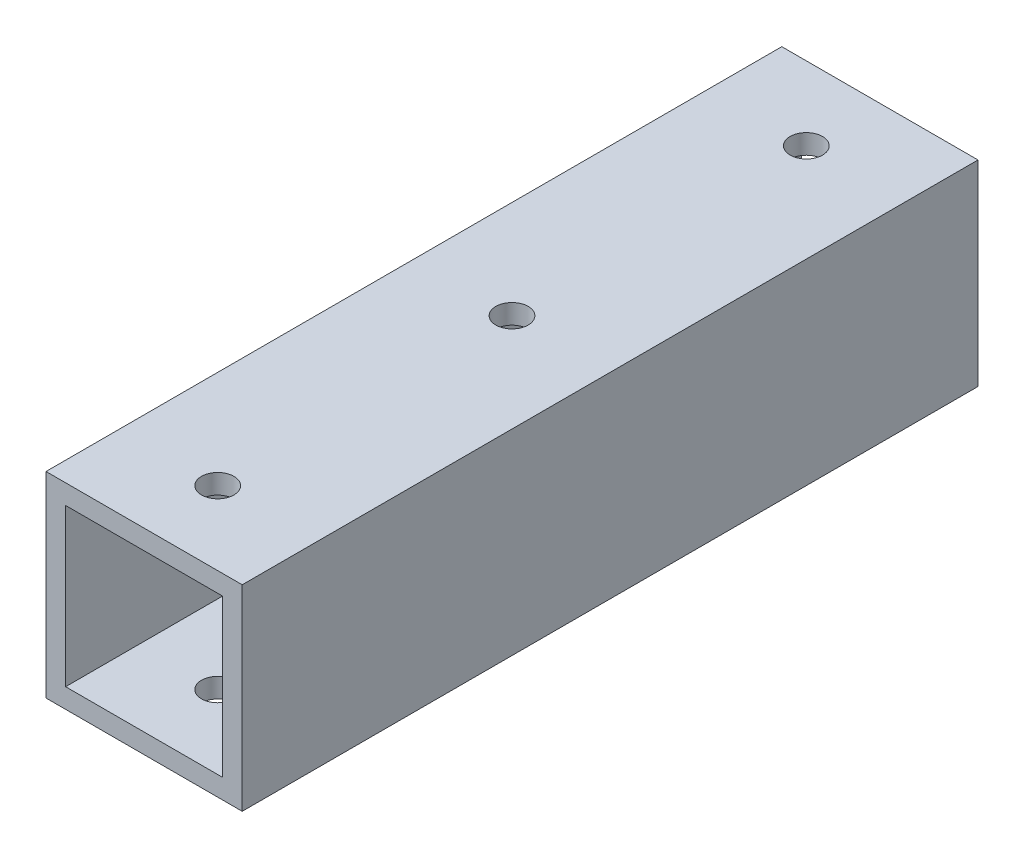
ISO-10303-21;
HEADER;
FILE_DESCRIPTION(('STEP AP214'),'2;1');
FILE_NAME('part.step','',(''),(''),'','','');
FILE_SCHEMA(('AUTOMOTIVE_DESIGN { 1 0 10303 214 1 1 1 1 }'));
ENDSEC;
DATA;
#1=APPLICATION_CONTEXT('core data for automotive mechanical design processes');
#2=APPLICATION_PROTOCOL_DEFINITION('international standard','automotive_design',2000,#1);
#3=PRODUCT_CONTEXT('',#1,'mechanical');
#4=PRODUCT('Part','Part','',(#3));
#5=PRODUCT_RELATED_PRODUCT_CATEGORY('part','',(#4));
#6=PRODUCT_DEFINITION_FORMATION('','',#4);
#7=PRODUCT_DEFINITION_CONTEXT('part definition',#1,'design');
#8=PRODUCT_DEFINITION('design','',#6,#7);
#9=PRODUCT_DEFINITION_SHAPE('','',#8);
#10=(LENGTH_UNIT() NAMED_UNIT(*) SI_UNIT(.MILLI.,.METRE.));
#11=(NAMED_UNIT(*) PLANE_ANGLE_UNIT() SI_UNIT($,.RADIAN.));
#12=(NAMED_UNIT(*) SI_UNIT($,.STERADIAN.) SOLID_ANGLE_UNIT());
#13=UNCERTAINTY_MEASURE_WITH_UNIT(LENGTH_MEASURE(1.E-05),#10,'distance_accuracy_value','');
#14=(GEOMETRIC_REPRESENTATION_CONTEXT(3) GLOBAL_UNCERTAINTY_ASSIGNED_CONTEXT((#13)) GLOBAL_UNIT_ASSIGNED_CONTEXT((#10,
#11,#12)) REPRESENTATION_CONTEXT('',''));
#15=CARTESIAN_POINT('',(0.,0.,0.));
#16=DIRECTION('',(0.,0.,1.));
#17=DIRECTION('',(1.,0.,0.));
#18=AXIS2_PLACEMENT_3D('',#15,#16,#17);
#19=CARTESIAN_POINT('',(0.,0.,75.));
#20=DIRECTION('',(0.,0.,1.));
#21=DIRECTION('',(1.,0.,0.));
#22=AXIS2_PLACEMENT_3D('',#19,#20,#21);
#23=PLANE('',#22);
#24=DIRECTION('',(0.,-1.,0.));
#25=VECTOR('',#24,1.);
#26=CARTESIAN_POINT('',(-10.,-10.,75.));
#27=LINE('',#26,#25);
#28=CARTESIAN_POINT('',(-10.,10.,75.));
#29=VERTEX_POINT('',#28);
#30=CARTESIAN_POINT('',(-10.,-10.,75.));
#31=VERTEX_POINT('',#30);
#32=EDGE_CURVE('E139',#29,#31,#27,.T.);
#33=ORIENTED_EDGE('',*,*,#32,.T.);
#34=DIRECTION('',(1.,0.,0.));
#35=VECTOR('',#34,1.);
#36=CARTESIAN_POINT('',(10.,-10.,75.));
#37=LINE('',#36,#35);
#38=CARTESIAN_POINT('',(10.,-10.,75.));
#39=VERTEX_POINT('',#38);
#40=EDGE_CURVE('E142',#31,#39,#37,.T.);
#41=ORIENTED_EDGE('',*,*,#40,.T.);
#42=DIRECTION('',(0.,1.,0.));
#43=VECTOR('',#42,1.);
#44=CARTESIAN_POINT('',(10.,-10.,75.));
#45=LINE('',#44,#43);
#46=CARTESIAN_POINT('',(10.,10.,75.));
#47=VERTEX_POINT('',#46);
#48=EDGE_CURVE('E145',#39,#47,#45,.T.);
#49=ORIENTED_EDGE('',*,*,#48,.T.);
#50=DIRECTION('',(-1.,0.,0.));
#51=VECTOR('',#50,1.);
#52=CARTESIAN_POINT('',(10.,10.,75.));
#53=LINE('',#52,#51);
#54=EDGE_CURVE('E147',#47,#29,#53,.T.);
#55=ORIENTED_EDGE('',*,*,#54,.T.);
#56=EDGE_LOOP('',(#33,#41,#49,#55));
#57=FACE_BOUND('',#56,.T.);
#58=DIRECTION('',(1.,0.,0.));
#59=VECTOR('',#58,1.);
#60=CARTESIAN_POINT('',(8.,-8.,75.));
#61=LINE('',#60,#59);
#62=CARTESIAN_POINT('',(-8.,-8.,75.));
#63=VERTEX_POINT('',#62);
#64=CARTESIAN_POINT('',(8.,-8.,75.));
#65=VERTEX_POINT('',#64);
#66=EDGE_CURVE('E109',#63,#65,#61,.T.);
#67=ORIENTED_EDGE('',*,*,#66,.F.);
#68=DIRECTION('',(0.,-1.,0.));
#69=VECTOR('',#68,1.);
#70=CARTESIAN_POINT('',(-8.,-8.,75.));
#71=LINE('',#70,#69);
#72=CARTESIAN_POINT('',(-8.,8.,75.));
#73=VERTEX_POINT('',#72);
#74=EDGE_CURVE('E101',#73,#63,#71,.T.);
#75=ORIENTED_EDGE('',*,*,#74,.F.);
#76=DIRECTION('',(-1.,0.,0.));
#77=VECTOR('',#76,1.);
#78=CARTESIAN_POINT('',(8.,8.,75.));
#79=LINE('',#78,#77);
#80=CARTESIAN_POINT('',(8.,8.,75.));
#81=VERTEX_POINT('',#80);
#82=EDGE_CURVE('E123',#81,#73,#79,.T.);
#83=ORIENTED_EDGE('',*,*,#82,.F.);
#84=DIRECTION('',(0.,1.,0.));
#85=VECTOR('',#84,1.);
#86=CARTESIAN_POINT('',(8.,-8.,75.));
#87=LINE('',#86,#85);
#88=EDGE_CURVE('E121',#65,#81,#87,.T.);
#89=ORIENTED_EDGE('',*,*,#88,.F.);
#90=EDGE_LOOP('',(#67,#75,#83,#89));
#91=FACE_BOUND('',#90,.T.);
#92=ADVANCED_FACE('F34',(#57,#91),#23,.T.);
#93=CARTESIAN_POINT('',(0.,0.,0.));
#94=DIRECTION('',(0.,0.,1.));
#95=DIRECTION('',(1.,0.,0.));
#96=AXIS2_PLACEMENT_3D('',#93,#94,#95);
#97=PLANE('',#96);
#98=DIRECTION('',(0.,-1.,0.));
#99=VECTOR('',#98,1.);
#100=CARTESIAN_POINT('',(-10.,-10.,0.));
#101=LINE('',#100,#99);
#102=CARTESIAN_POINT('',(-10.,10.,0.));
#103=VERTEX_POINT('',#102);
#104=CARTESIAN_POINT('',(-10.,-10.,0.));
#105=VERTEX_POINT('',#104);
#106=EDGE_CURVE('E117',#103,#105,#101,.T.);
#107=ORIENTED_EDGE('',*,*,#106,.F.);
#108=DIRECTION('',(-1.,0.,0.));
#109=VECTOR('',#108,1.);
#110=CARTESIAN_POINT('',(10.,10.,0.));
#111=LINE('',#110,#109);
#112=CARTESIAN_POINT('',(10.,10.,0.));
#113=VERTEX_POINT('',#112);
#114=EDGE_CURVE('E143',#113,#103,#111,.T.);
#115=ORIENTED_EDGE('',*,*,#114,.F.);
#116=DIRECTION('',(0.,1.,0.));
#117=VECTOR('',#116,1.);
#118=CARTESIAN_POINT('',(10.,-10.,0.));
#119=LINE('',#118,#117);
#120=CARTESIAN_POINT('',(10.,-10.,0.));
#121=VERTEX_POINT('',#120);
#122=EDGE_CURVE('E154',#121,#113,#119,.T.);
#123=ORIENTED_EDGE('',*,*,#122,.F.);
#124=DIRECTION('',(1.,0.,0.));
#125=VECTOR('',#124,1.);
#126=CARTESIAN_POINT('',(10.,-10.,0.));
#127=LINE('',#126,#125);
#128=EDGE_CURVE('E152',#105,#121,#127,.T.);
#129=ORIENTED_EDGE('',*,*,#128,.F.);
#130=EDGE_LOOP('',(#107,#115,#123,#129));
#131=FACE_BOUND('',#130,.T.);
#132=DIRECTION('',(0.,-1.,0.));
#133=VECTOR('',#132,1.);
#134=CARTESIAN_POINT('',(-8.,-8.,0.));
#135=LINE('',#134,#133);
#136=CARTESIAN_POINT('',(-8.,8.,0.));
#137=VERTEX_POINT('',#136);
#138=CARTESIAN_POINT('',(-8.,-8.,0.));
#139=VERTEX_POINT('',#138);
#140=EDGE_CURVE('E59',#137,#139,#135,.T.);
#141=ORIENTED_EDGE('',*,*,#140,.T.);
#142=DIRECTION('',(1.,0.,0.));
#143=VECTOR('',#142,1.);
#144=CARTESIAN_POINT('',(8.,-8.,0.));
#145=LINE('',#144,#143);
#146=CARTESIAN_POINT('',(8.,-8.,0.));
#147=VERTEX_POINT('',#146);
#148=EDGE_CURVE('E116',#139,#147,#145,.T.);
#149=ORIENTED_EDGE('',*,*,#148,.T.);
#150=DIRECTION('',(0.,1.,0.));
#151=VECTOR('',#150,1.);
#152=CARTESIAN_POINT('',(8.,-8.,0.));
#153=LINE('',#152,#151);
#154=CARTESIAN_POINT('',(8.,8.,0.));
#155=VERTEX_POINT('',#154);
#156=EDGE_CURVE('E131',#147,#155,#153,.T.);
#157=ORIENTED_EDGE('',*,*,#156,.T.);
#158=DIRECTION('',(-1.,0.,0.));
#159=VECTOR('',#158,1.);
#160=CARTESIAN_POINT('',(8.,8.,0.));
#161=LINE('',#160,#159);
#162=EDGE_CURVE('E110',#155,#137,#161,.T.);
#163=ORIENTED_EDGE('',*,*,#162,.T.);
#164=EDGE_LOOP('',(#141,#149,#157,#163));
#165=FACE_BOUND('',#164,.T.);
#166=ADVANCED_FACE('F212',(#131,#165),#97,.F.);
#167=CARTESIAN_POINT('',(-10.,-10.,75.));
#168=DIRECTION('',(1.,0.,0.));
#169=DIRECTION('',(0.,1.,0.));
#170=AXIS2_PLACEMENT_3D('',#167,#168,#169);
#171=PLANE('',#170);
#172=ORIENTED_EDGE('',*,*,#106,.T.);
#173=DIRECTION('',(0.,0.,-1.));
#174=VECTOR('',#173,1.);
#175=CARTESIAN_POINT('',(-10.,-10.,75.));
#176=LINE('',#175,#174);
#177=EDGE_CURVE('E11',#31,#105,#176,.T.);
#178=ORIENTED_EDGE('',*,*,#177,.F.);
#179=ORIENTED_EDGE('',*,*,#32,.F.);
#180=DIRECTION('',(0.,0.,-1.));
#181=VECTOR('',#180,1.);
#182=CARTESIAN_POINT('',(-10.,10.,75.));
#183=LINE('',#182,#181);
#184=EDGE_CURVE('E149',#29,#103,#183,.T.);
#185=ORIENTED_EDGE('',*,*,#184,.T.);
#186=EDGE_LOOP('',(#172,#178,#179,#185));
#187=FACE_BOUND('',#186,.T.);
#188=ADVANCED_FACE('F36',(#187),#171,.F.);
#189=CARTESIAN_POINT('',(10.,-10.,75.));
#190=DIRECTION('',(0.,1.,0.));
#191=DIRECTION('',(-1.,0.,0.));
#192=AXIS2_PLACEMENT_3D('',#189,#190,#191);
#193=PLANE('',#192);
#194=CARTESIAN_POINT('',(0.,-10.,67.5));
#195=DIRECTION('',(0.,1.,0.));
#196=DIRECTION('',(-1.,0.,0.));
#197=AXIS2_PLACEMENT_3D('',#194,#195,#196);
#198=CIRCLE('',#197,1.65);
#199=CARTESIAN_POINT('',(-1.65,-10.,67.5));
#200=VERTEX_POINT('',#199);
#201=EDGE_CURVE('E129',#200,#200,#198,.T.);
#202=ORIENTED_EDGE('',*,*,#201,.T.);
#203=EDGE_LOOP('',(#202));
#204=FACE_BOUND('',#203,.T.);
#205=CARTESIAN_POINT('',(0.,-10.,7.5));
#206=DIRECTION('',(0.,1.,0.));
#207=DIRECTION('',(-1.,0.,0.));
#208=AXIS2_PLACEMENT_3D('',#205,#206,#207);
#209=CIRCLE('',#208,1.65);
#210=CARTESIAN_POINT('',(-1.65,-10.,7.5));
#211=VERTEX_POINT('',#210);
#212=EDGE_CURVE('E175',#211,#211,#209,.T.);
#213=ORIENTED_EDGE('',*,*,#212,.T.);
#214=EDGE_LOOP('',(#213));
#215=FACE_BOUND('',#214,.T.);
#216=CARTESIAN_POINT('',(0.,-10.,37.5));
#217=DIRECTION('',(0.,1.,0.));
#218=DIRECTION('',(-1.,0.,0.));
#219=AXIS2_PLACEMENT_3D('',#216,#217,#218);
#220=CIRCLE('',#219,1.65);
#221=CARTESIAN_POINT('',(-1.65,-10.,37.5));
#222=VERTEX_POINT('',#221);
#223=EDGE_CURVE('E171',#222,#222,#220,.T.);
#224=ORIENTED_EDGE('',*,*,#223,.T.);
#225=EDGE_LOOP('',(#224));
#226=FACE_BOUND('',#225,.T.);
#227=ORIENTED_EDGE('',*,*,#128,.T.);
#228=DIRECTION('',(0.,0.,-1.));
#229=VECTOR('',#228,1.);
#230=CARTESIAN_POINT('',(10.,-10.,75.));
#231=LINE('',#230,#229);
#232=EDGE_CURVE('E43',#39,#121,#231,.T.);
#233=ORIENTED_EDGE('',*,*,#232,.F.);
#234=ORIENTED_EDGE('',*,*,#40,.F.);
#235=ORIENTED_EDGE('',*,*,#177,.T.);
#236=EDGE_LOOP('',(#227,#233,#234,#235));
#237=FACE_BOUND('',#236,.T.);
#238=ADVANCED_FACE('F192',(#204,#215,#226,#237),#193,.F.);
#239=CARTESIAN_POINT('',(10.,-10.,75.));
#240=DIRECTION('',(-1.,0.,0.));
#241=DIRECTION('',(0.,0.,1.));
#242=AXIS2_PLACEMENT_3D('',#239,#240,#241);
#243=PLANE('',#242);
#244=ORIENTED_EDGE('',*,*,#122,.T.);
#245=DIRECTION('',(0.,0.,-1.));
#246=VECTOR('',#245,1.);
#247=CARTESIAN_POINT('',(10.,10.,75.));
#248=LINE('',#247,#246);
#249=EDGE_CURVE('E159',#47,#113,#248,.T.);
#250=ORIENTED_EDGE('',*,*,#249,.F.);
#251=ORIENTED_EDGE('',*,*,#48,.F.);
#252=ORIENTED_EDGE('',*,*,#232,.T.);
#253=EDGE_LOOP('',(#244,#250,#251,#252));
#254=FACE_BOUND('',#253,.T.);
#255=ADVANCED_FACE('F226',(#254),#243,.F.);
#256=CARTESIAN_POINT('',(10.,10.,75.));
#257=DIRECTION('',(0.,-1.,0.));
#258=DIRECTION('',(0.,0.,-1.));
#259=AXIS2_PLACEMENT_3D('',#256,#257,#258);
#260=PLANE('',#259);
#261=CARTESIAN_POINT('',(0.,10.,67.5));
#262=DIRECTION('',(0.,1.,0.));
#263=DIRECTION('',(0.,0.,1.));
#264=AXIS2_PLACEMENT_3D('',#261,#262,#263);
#265=CIRCLE('',#264,1.65);
#266=CARTESIAN_POINT('',(0.,10.,69.15));
#267=VERTEX_POINT('',#266);
#268=EDGE_CURVE('E369',#267,#267,#265,.T.);
#269=ORIENTED_EDGE('',*,*,#268,.F.);
#270=EDGE_LOOP('',(#269));
#271=FACE_BOUND('',#270,.T.);
#272=CARTESIAN_POINT('',(0.,10.,7.5));
#273=DIRECTION('',(0.,1.,0.));
#274=DIRECTION('',(0.,0.,1.));
#275=AXIS2_PLACEMENT_3D('',#272,#273,#274);
#276=CIRCLE('',#275,1.65);
#277=CARTESIAN_POINT('',(0.,10.,9.15));
#278=VERTEX_POINT('',#277);
#279=EDGE_CURVE('E367',#278,#278,#276,.T.);
#280=ORIENTED_EDGE('',*,*,#279,.F.);
#281=EDGE_LOOP('',(#280));
#282=FACE_BOUND('',#281,.T.);
#283=CARTESIAN_POINT('',(0.,10.,37.5));
#284=DIRECTION('',(0.,1.,0.));
#285=DIRECTION('',(0.,0.,1.));
#286=AXIS2_PLACEMENT_3D('',#283,#284,#285);
#287=CIRCLE('',#286,1.65);
#288=CARTESIAN_POINT('',(0.,10.,39.15));
#289=VERTEX_POINT('',#288);
#290=EDGE_CURVE('E167',#289,#289,#287,.T.);
#291=ORIENTED_EDGE('',*,*,#290,.F.);
#292=EDGE_LOOP('',(#291));
#293=FACE_BOUND('',#292,.T.);
#294=ORIENTED_EDGE('',*,*,#114,.T.);
#295=ORIENTED_EDGE('',*,*,#184,.F.);
#296=ORIENTED_EDGE('',*,*,#54,.F.);
#297=ORIENTED_EDGE('',*,*,#249,.T.);
#298=EDGE_LOOP('',(#294,#295,#296,#297));
#299=FACE_BOUND('',#298,.T.);
#300=ADVANCED_FACE('F223',(#271,#282,#293,#299),#260,.F.);
#301=CARTESIAN_POINT('',(-8.,-8.,75.));
#302=DIRECTION('',(1.,0.,0.));
#303=DIRECTION('',(0.,0.,-1.));
#304=AXIS2_PLACEMENT_3D('',#301,#302,#303);
#305=PLANE('',#304);
#306=ORIENTED_EDGE('',*,*,#140,.F.);
#307=DIRECTION('',(0.,0.,-1.));
#308=VECTOR('',#307,1.);
#309=CARTESIAN_POINT('',(-8.,8.,75.));
#310=LINE('',#309,#308);
#311=EDGE_CURVE('E105',#73,#137,#310,.T.);
#312=ORIENTED_EDGE('',*,*,#311,.F.);
#313=ORIENTED_EDGE('',*,*,#74,.T.);
#314=DIRECTION('',(0.,0.,-1.));
#315=VECTOR('',#314,1.);
#316=CARTESIAN_POINT('',(-8.,-8.,75.));
#317=LINE('',#316,#315);
#318=EDGE_CURVE('E104',#63,#139,#317,.T.);
#319=ORIENTED_EDGE('',*,*,#318,.T.);
#320=EDGE_LOOP('',(#306,#312,#313,#319));
#321=FACE_BOUND('',#320,.T.);
#322=ADVANCED_FACE('F103',(#321),#305,.T.);
#323=CARTESIAN_POINT('',(8.,-8.,75.));
#324=DIRECTION('',(0.,1.,0.));
#325=DIRECTION('',(-1.,0.,0.));
#326=AXIS2_PLACEMENT_3D('',#323,#324,#325);
#327=PLANE('',#326);
#328=CARTESIAN_POINT('',(0.,-8.,67.5));
#329=DIRECTION('',(0.,1.,0.));
#330=DIRECTION('',(-1.,0.,0.));
#331=AXIS2_PLACEMENT_3D('',#328,#329,#330);
#332=CIRCLE('',#331,1.65);
#333=CARTESIAN_POINT('',(-1.65,-8.,67.5));
#334=VERTEX_POINT('',#333);
#335=EDGE_CURVE('E187',#334,#334,#332,.T.);
#336=ORIENTED_EDGE('',*,*,#335,.F.);
#337=EDGE_LOOP('',(#336));
#338=FACE_BOUND('',#337,.T.);
#339=CARTESIAN_POINT('',(0.,-8.,7.5));
#340=DIRECTION('',(0.,1.,0.));
#341=DIRECTION('',(-1.,0.,0.));
#342=AXIS2_PLACEMENT_3D('',#339,#340,#341);
#343=CIRCLE('',#342,1.65);
#344=CARTESIAN_POINT('',(-1.65,-8.,7.5));
#345=VERTEX_POINT('',#344);
#346=EDGE_CURVE('E170',#345,#345,#343,.T.);
#347=ORIENTED_EDGE('',*,*,#346,.F.);
#348=EDGE_LOOP('',(#347));
#349=FACE_BOUND('',#348,.T.);
#350=CARTESIAN_POINT('',(0.,-8.,37.5));
#351=DIRECTION('',(0.,1.,0.));
#352=DIRECTION('',(-1.,0.,0.));
#353=AXIS2_PLACEMENT_3D('',#350,#351,#352);
#354=CIRCLE('',#353,1.65);
#355=CARTESIAN_POINT('',(-1.65,-8.,37.5));
#356=VERTEX_POINT('',#355);
#357=EDGE_CURVE('E166',#356,#356,#354,.T.);
#358=ORIENTED_EDGE('',*,*,#357,.F.);
#359=EDGE_LOOP('',(#358));
#360=FACE_BOUND('',#359,.T.);
#361=ORIENTED_EDGE('',*,*,#148,.F.);
#362=ORIENTED_EDGE('',*,*,#318,.F.);
#363=ORIENTED_EDGE('',*,*,#66,.T.);
#364=DIRECTION('',(0.,0.,-1.));
#365=VECTOR('',#364,1.);
#366=CARTESIAN_POINT('',(8.,-8.,75.));
#367=LINE('',#366,#365);
#368=EDGE_CURVE('E118',#65,#147,#367,.T.);
#369=ORIENTED_EDGE('',*,*,#368,.T.);
#370=EDGE_LOOP('',(#361,#362,#363,#369));
#371=FACE_BOUND('',#370,.T.);
#372=ADVANCED_FACE('F113',(#338,#349,#360,#371),#327,.T.);
#373=CARTESIAN_POINT('',(8.,-8.,75.));
#374=DIRECTION('',(-1.,0.,0.));
#375=DIRECTION('',(0.,0.,1.));
#376=AXIS2_PLACEMENT_3D('',#373,#374,#375);
#377=PLANE('',#376);
#378=ORIENTED_EDGE('',*,*,#156,.F.);
#379=ORIENTED_EDGE('',*,*,#368,.F.);
#380=ORIENTED_EDGE('',*,*,#88,.T.);
#381=DIRECTION('',(0.,0.,-1.));
#382=VECTOR('',#381,1.);
#383=CARTESIAN_POINT('',(8.,8.,75.));
#384=LINE('',#383,#382);
#385=EDGE_CURVE('E51',#81,#155,#384,.T.);
#386=ORIENTED_EDGE('',*,*,#385,.T.);
#387=EDGE_LOOP('',(#378,#379,#380,#386));
#388=FACE_BOUND('',#387,.T.);
#389=ADVANCED_FACE('F254',(#388),#377,.T.);
#390=CARTESIAN_POINT('',(8.,8.,75.));
#391=DIRECTION('',(0.,-1.,0.));
#392=DIRECTION('',(1.,0.,0.));
#393=AXIS2_PLACEMENT_3D('',#390,#391,#392);
#394=PLANE('',#393);
#395=CARTESIAN_POINT('',(0.,8.,67.5));
#396=DIRECTION('',(0.,-1.,0.));
#397=DIRECTION('',(1.,0.,0.));
#398=AXIS2_PLACEMENT_3D('',#395,#396,#397);
#399=CIRCLE('',#398,1.65);
#400=CARTESIAN_POINT('',(1.65,8.,67.5));
#401=VERTEX_POINT('',#400);
#402=EDGE_CURVE('E38',#401,#401,#399,.T.);
#403=ORIENTED_EDGE('',*,*,#402,.F.);
#404=EDGE_LOOP('',(#403));
#405=FACE_BOUND('',#404,.T.);
#406=CARTESIAN_POINT('',(0.,8.,7.5));
#407=DIRECTION('',(0.,-1.,0.));
#408=DIRECTION('',(1.,0.,0.));
#409=AXIS2_PLACEMENT_3D('',#406,#407,#408);
#410=CIRCLE('',#409,1.65);
#411=CARTESIAN_POINT('',(1.65,8.,7.5));
#412=VERTEX_POINT('',#411);
#413=EDGE_CURVE('E168',#412,#412,#410,.T.);
#414=ORIENTED_EDGE('',*,*,#413,.F.);
#415=EDGE_LOOP('',(#414));
#416=FACE_BOUND('',#415,.T.);
#417=CARTESIAN_POINT('',(0.,8.,37.5));
#418=DIRECTION('',(0.,-1.,0.));
#419=DIRECTION('',(1.,0.,0.));
#420=AXIS2_PLACEMENT_3D('',#417,#418,#419);
#421=CIRCLE('',#420,1.65);
#422=CARTESIAN_POINT('',(1.65,8.,37.5));
#423=VERTEX_POINT('',#422);
#424=EDGE_CURVE('E164',#423,#423,#421,.T.);
#425=ORIENTED_EDGE('',*,*,#424,.F.);
#426=EDGE_LOOP('',(#425));
#427=FACE_BOUND('',#426,.T.);
#428=ORIENTED_EDGE('',*,*,#162,.F.);
#429=ORIENTED_EDGE('',*,*,#385,.F.);
#430=ORIENTED_EDGE('',*,*,#82,.T.);
#431=ORIENTED_EDGE('',*,*,#311,.T.);
#432=EDGE_LOOP('',(#428,#429,#430,#431));
#433=FACE_BOUND('',#432,.T.);
#434=ADVANCED_FACE('F251',(#405,#416,#427,#433),#394,.T.);
#435=CARTESIAN_POINT('',(0.,-60.,37.5));
#436=DIRECTION('',(0.,1.,0.));
#437=DIRECTION('',(0.,0.,1.));
#438=AXIS2_PLACEMENT_3D('',#435,#436,#437);
#439=CYLINDRICAL_SURFACE('',#438,1.65);
#440=ORIENTED_EDGE('',*,*,#424,.T.);
#441=EDGE_LOOP('',(#440));
#442=FACE_BOUND('',#441,.T.);
#443=ORIENTED_EDGE('',*,*,#290,.T.);
#444=EDGE_LOOP('',(#443));
#445=FACE_BOUND('',#444,.T.);
#446=ADVANCED_FACE('F253',(#442,#445),#439,.F.);
#447=CARTESIAN_POINT('',(0.,-60.,7.5));
#448=DIRECTION('',(0.,1.,0.));
#449=DIRECTION('',(0.,0.,1.));
#450=AXIS2_PLACEMENT_3D('',#447,#448,#449);
#451=CYLINDRICAL_SURFACE('',#450,1.65);
#452=ORIENTED_EDGE('',*,*,#413,.T.);
#453=EDGE_LOOP('',(#452));
#454=FACE_BOUND('',#453,.T.);
#455=ORIENTED_EDGE('',*,*,#279,.T.);
#456=EDGE_LOOP('',(#455));
#457=FACE_BOUND('',#456,.T.);
#458=ADVANCED_FACE('F207',(#454,#457),#451,.F.);
#459=CARTESIAN_POINT('',(0.,-60.,67.5));
#460=DIRECTION('',(0.,1.,0.));
#461=DIRECTION('',(0.,0.,1.));
#462=AXIS2_PLACEMENT_3D('',#459,#460,#461);
#463=CYLINDRICAL_SURFACE('',#462,1.65);
#464=ORIENTED_EDGE('',*,*,#402,.T.);
#465=EDGE_LOOP('',(#464));
#466=FACE_BOUND('',#465,.T.);
#467=ORIENTED_EDGE('',*,*,#268,.T.);
#468=EDGE_LOOP('',(#467));
#469=FACE_BOUND('',#468,.T.);
#470=ADVANCED_FACE('F200',(#466,#469),#463,.F.);
#471=ORIENTED_EDGE('',*,*,#357,.T.);
#472=EDGE_LOOP('',(#471));
#473=FACE_BOUND('',#472,.T.);
#474=ORIENTED_EDGE('',*,*,#223,.F.);
#475=EDGE_LOOP('',(#474));
#476=FACE_BOUND('',#475,.T.);
#477=ADVANCED_FACE('F204',(#473,#476),#439,.F.);
#478=ORIENTED_EDGE('',*,*,#346,.T.);
#479=EDGE_LOOP('',(#478));
#480=FACE_BOUND('',#479,.T.);
#481=ORIENTED_EDGE('',*,*,#212,.F.);
#482=EDGE_LOOP('',(#481));
#483=FACE_BOUND('',#482,.T.);
#484=ADVANCED_FACE('F197',(#480,#483),#451,.F.);
#485=ORIENTED_EDGE('',*,*,#335,.T.);
#486=EDGE_LOOP('',(#485));
#487=FACE_BOUND('',#486,.T.);
#488=ORIENTED_EDGE('',*,*,#201,.F.);
#489=EDGE_LOOP('',(#488));
#490=FACE_BOUND('',#489,.T.);
#491=ADVANCED_FACE('F195',(#487,#490),#463,.F.);
#492=CLOSED_SHELL('',(#92,#166,#188,#238,#255,#300,#322,#372,#389,#434,#446,#458,#470,#477,#484,#491));
#493=MANIFOLD_SOLID_BREP('B2',#492);
#494=ADVANCED_BREP_SHAPE_REPRESENTATION('',(#18,#493),#14);
#495=SHAPE_DEFINITION_REPRESENTATION(#9,#494);
ENDSEC;
END-ISO-10303-21;
